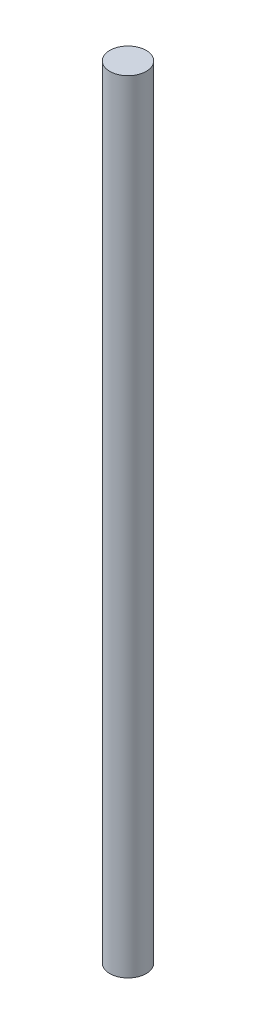
ISO-10303-21;
HEADER;
FILE_DESCRIPTION(('STEP AP214'),'2;1');
FILE_NAME('part.step','',(''),(''),'','','');
FILE_SCHEMA(('AUTOMOTIVE_DESIGN { 1 0 10303 214 1 1 1 1 }'));
ENDSEC;
DATA;
#1=APPLICATION_CONTEXT('core data for automotive mechanical design processes');
#2=APPLICATION_PROTOCOL_DEFINITION('international standard','automotive_design',2000,#1);
#3=PRODUCT_CONTEXT('',#1,'mechanical');
#4=PRODUCT('Part','Part','',(#3));
#5=PRODUCT_RELATED_PRODUCT_CATEGORY('part','',(#4));
#6=PRODUCT_DEFINITION_FORMATION('','',#4);
#7=PRODUCT_DEFINITION_CONTEXT('part definition',#1,'design');
#8=PRODUCT_DEFINITION('design','',#6,#7);
#9=PRODUCT_DEFINITION_SHAPE('','',#8);
#10=(LENGTH_UNIT() NAMED_UNIT(*) SI_UNIT(.MILLI.,.METRE.));
#11=(NAMED_UNIT(*) PLANE_ANGLE_UNIT() SI_UNIT($,.RADIAN.));
#12=(NAMED_UNIT(*) SI_UNIT($,.STERADIAN.) SOLID_ANGLE_UNIT());
#13=UNCERTAINTY_MEASURE_WITH_UNIT(LENGTH_MEASURE(1.E-05),#10,'distance_accuracy_value','');
#14=(GEOMETRIC_REPRESENTATION_CONTEXT(3) GLOBAL_UNCERTAINTY_ASSIGNED_CONTEXT((#13)) GLOBAL_UNIT_ASSIGNED_CONTEXT((#10,
#11,#12)) REPRESENTATION_CONTEXT('',''));
#15=CARTESIAN_POINT('',(0.,0.,0.));
#16=DIRECTION('',(0.,0.,1.));
#17=DIRECTION('',(1.,0.,0.));
#18=AXIS2_PLACEMENT_3D('',#15,#16,#17);
#19=CARTESIAN_POINT('',(2.4,103.,0.));
#20=DIRECTION('',(0.,-1.,0.));
#21=DIRECTION('',(0.,0.,-1.));
#22=AXIS2_PLACEMENT_3D('',#19,#20,#21);
#23=CYLINDRICAL_SURFACE('',#22,2.4);
#24=CARTESIAN_POINT('',(2.4,103.,0.));
#25=DIRECTION('',(0.,1.,0.));
#26=DIRECTION('',(0.,0.,1.));
#27=AXIS2_PLACEMENT_3D('',#24,#25,#26);
#28=CIRCLE('',#27,2.4);
#29=CARTESIAN_POINT('',(2.4,103.,2.4));
#30=VERTEX_POINT('',#29);
#31=EDGE_CURVE('E112',#30,#30,#28,.T.);
#32=ORIENTED_EDGE('',*,*,#31,.F.);
#33=EDGE_LOOP('',(#32));
#34=FACE_BOUND('',#33,.T.);
#35=CARTESIAN_POINT('',(2.4,0.,0.));
#36=DIRECTION('',(0.,1.,0.));
#37=DIRECTION('',(0.,0.,1.));
#38=AXIS2_PLACEMENT_3D('',#35,#36,#37);
#39=CIRCLE('',#38,2.4);
#40=CARTESIAN_POINT('',(2.4,0.,2.4));
#41=VERTEX_POINT('',#40);
#42=EDGE_CURVE('E113',#41,#41,#39,.T.);
#43=ORIENTED_EDGE('',*,*,#42,.T.);
#44=EDGE_LOOP('',(#43));
#45=FACE_BOUND('',#44,.T.);
#46=CARTESIAN_POINT('',(0.526500600480482,100.5,1.5));
#47=CARTESIAN_POINT('',(0.526490399129299,100.574544338164,1.49999354652582));
#48=CARTESIAN_POINT('',(0.521968287493959,100.649205402444,1.49439232619599));
#49=CARTESIAN_POINT('',(0.504675393534264,100.796011584095,1.47238740999521));
#50=CARTESIAN_POINT('',(0.491882202430618,100.868149303638,1.45595436516661));
#51=CARTESIAN_POINT('',(0.4601989760515,101.007338787239,1.41345688694244));
#52=CARTESIAN_POINT('',(0.441361950983593,101.074428730418,1.3874759199934));
#53=CARTESIAN_POINT('',(0.399804591426797,101.203210633966,1.32686334674307));
#54=CARTESIAN_POINT('',(0.377084151015873,101.264902447028,1.29223150447307));
#55=CARTESIAN_POINT('',(0.326644663503442,101.390238185372,1.20988725514034));
#56=CARTESIAN_POINT('',(0.298663941271822,101.453033688999,1.16104331243096));
#57=CARTESIAN_POINT('',(0.242966149741456,101.570259238974,1.05397039739621));
#58=CARTESIAN_POINT('',(0.215249329640026,101.624681996741,0.995733337556844));
#59=CARTESIAN_POINT('',(0.159246553307865,101.730124302178,0.86302399831013));
#60=CARTESIAN_POINT('',(0.131295333102577,101.779941201725,0.787440682692604));
#61=CARTESIAN_POINT('',(0.081801219610297,101.865750245716,0.626884885004711));
#62=CARTESIAN_POINT('',(0.0602519858419225,101.901756078902,0.541921807773821));
#63=CARTESIAN_POINT('',(0.0279619041815897,101.954978772728,0.374132254034361));
#64=CARTESIAN_POINT('',(0.0163449309355592,101.973733699676,0.291966763256634));
#65=CARTESIAN_POINT('',(0.00179346744954645,101.997158483572,0.124926120794642));
#66=CARTESIAN_POINT('',(-0.00115015012398108,102.001843147345,0.0400539126767328));
#67=CARTESIAN_POINT('',(0.00176509070975714,101.997173172867,-0.117678994105642));
#68=CARTESIAN_POINT('',(0.0064956022574745,101.989618348439,-0.1906230279285));
#69=CARTESIAN_POINT('',(0.0222567328650142,101.964159618764,-0.33396797508457));
#70=CARTESIAN_POINT('',(0.0332878280975076,101.946254931315,-0.404368695776821));
#71=CARTESIAN_POINT('',(0.0607423966250082,101.900875469884,-0.541066940492147));
#72=CARTESIAN_POINT('',(0.0771796599171637,101.873376211142,-0.607353450590457));
#73=CARTESIAN_POINT('',(0.11417240532395,101.809837493687,-0.734423064564793));
#74=CARTESIAN_POINT('',(0.13472882549401,101.773796089329,-0.795204910277576));
#75=CARTESIAN_POINT('',(0.181281303007696,101.689166201607,-0.917656218674287));
#76=CARTESIAN_POINT('',(0.207635948382164,101.63957444792,-0.978494813878273));
#77=CARTESIAN_POINT('',(0.2616544469052,101.531841143721,-1.09151831511118));
#78=CARTESIAN_POINT('',(0.289320162355111,101.473687168224,-1.14369040663963));
#79=CARTESIAN_POINT('',(0.347142694942328,101.341553252557,-1.24482535061207));
#80=CARTESIAN_POINT('',(0.377153022743614,101.266498343157,-1.292479385349));
#81=CARTESIAN_POINT('',(0.431830331980405,101.107624656449,-1.37431383803494));
#82=CARTESIAN_POINT('',(0.456507117957947,101.023822387297,-1.40851907514657));
#83=CARTESIAN_POINT('',(0.49089748100341,100.872276716506,-1.45462280230583));
#84=CARTESIAN_POINT('',(0.502839548285552,100.806106844827,-1.47002210067883));
#85=CARTESIAN_POINT('',(0.519850333541949,100.671461773509,-1.49172202243215));
#86=CARTESIAN_POINT('',(0.52492844116458,100.602989854754,-1.49803507623444));
#87=CARTESIAN_POINT('',(0.527446397624287,100.46552558335,-1.50118243145897));
#88=CARTESIAN_POINT('',(0.524868742311096,100.39653239836,-1.49799501092022));
#89=CARTESIAN_POINT('',(0.512447485651224,100.260263302763,-1.48230880267053));
#90=CARTESIAN_POINT('',(0.502597867145096,100.192988862045,-1.46980230384279));
#91=CARTESIAN_POINT('',(0.477239272775543,100.062937939361,-1.43645922869829));
#92=CARTESIAN_POINT('',(0.461826264753677,100.000105592002,-1.41576336752154));
#93=CARTESIAN_POINT('',(0.427013118710151,99.8786551985316,-1.36682942326217));
#94=CARTESIAN_POINT('',(0.407611566121163,99.8200386575706,-1.33858866325701));
#95=CARTESIAN_POINT('',(0.362553552132653,99.6968327529875,-1.26918452126784));
#96=CARTESIAN_POINT('',(0.336409491140486,99.6332309505007,-1.22658448577063));
#97=CARTESIAN_POINT('',(0.283272503991474,99.513377937073,-1.1324283158698));
#98=CARTESIAN_POINT('',(0.256278721159742,99.4571344596264,-1.08086288939589));
#99=CARTESIAN_POINT('',(0.199402031772306,99.3444201045082,-0.960456791398999));
#100=CARTESIAN_POINT('',(0.169749542548816,99.2893577315907,-0.890171939656956));
#101=CARTESIAN_POINT('',(0.115389012419995,99.1919176177489,-0.739559985443443));
#102=CARTESIAN_POINT('',(0.0906786560503944,99.1495339320316,-0.65923761449834));
#103=CARTESIAN_POINT('',(0.0502889285092514,99.0816060105568,-0.495511080763861));
#104=CARTESIAN_POINT('',(0.0341581849298273,99.0552069522351,-0.412577787053365));
#105=CARTESIAN_POINT('',(0.0107158789435176,99.0171279975827,-0.242233198661639));
#106=CARTESIAN_POINT('',(0.00339211280395738,99.0054277322866,-0.154828275885984));
#107=CARTESIAN_POINT('',(-0.00116022898270439,98.9981441759535,0.00791888639622863));
#108=CARTESIAN_POINT('',(0.000280792516601063,99.0004370678556,0.0831375571146215));
#109=CARTESIAN_POINT('',(0.0100711204947391,99.0161540099692,0.23193577331012));
#110=CARTESIAN_POINT('',(0.0184201135017882,99.0295775550909,0.305515393008939));
#111=CARTESIAN_POINT('',(0.0408467437322515,99.0661925698519,0.446451953622679));
#112=CARTESIAN_POINT('',(0.0547155903395981,99.0890290078478,0.51393621681402));
#113=CARTESIAN_POINT('',(0.0870603758728363,99.1434719137969,0.644057242933626));
#114=CARTESIAN_POINT('',(0.105537092023147,99.1750798613707,0.706693185741933));
#115=CARTESIAN_POINT('',(0.147895893122121,99.2497926947895,0.832388084964844));
#116=CARTESIAN_POINT('',(0.172139970396548,99.2937503775828,0.894816152594698));
#117=CARTESIAN_POINT('',(0.222796314525167,99.3900919563993,1.01185993002654));
#118=CARTESIAN_POINT('',(0.249211011232573,99.4424853602952,1.06646669166631));
#119=CARTESIAN_POINT('',(0.305995018805721,99.562939514764,1.174468321561));
#120=CARTESIAN_POINT('',(0.336385542644253,99.6321700142123,1.22655395848582));
#121=CARTESIAN_POINT('',(0.393902142035578,99.7795735992122,1.31852790006896));
#122=CARTESIAN_POINT('',(0.421030017995401,99.8577417058892,1.35842295068522));
#123=CARTESIAN_POINT('',(0.462842687037452,100.003683321516,1.41718933107879));
#124=CARTESIAN_POINT('',(0.478951915804186,100.069962817055,1.43875459531659));
#125=CARTESIAN_POINT('',(0.504730098744737,100.205963133549,1.4725538661649));
#126=CARTESIAN_POINT('',(0.514419427197902,100.275672306029,1.48481741094486));
#127=CARTESIAN_POINT('',(0.522282523327276,100.371636628635,1.49471887419717));
#128=CARTESIAN_POINT('',(0.523859165438082,100.39723697462,1.49669605511497));
#129=CARTESIAN_POINT('',(0.525970095659443,100.448553559826,1.49933789681146));
#130=CARTESIAN_POINT('',(0.526504121640394,100.474269826562,1.50000222752008));
#131=CARTESIAN_POINT('',(0.526500600480482,100.5,1.5));
#132=B_SPLINE_CURVE_WITH_KNOTS('',3,(#46,#47,#48,#49,#50,#51,#52,#53,#54,#55,#56,#57,#58,#59,
#60,#61,#62,#63,#64,#65,#66,#67,#68,#69,#70,#71,#72,#73,#74,#75,#76,#77,#78,#79,#80,#81,#82,#83,
#84,#85,#86,#87,#88,#89,#90,#91,#92,#93,#94,#95,#96,#97,#98,#99,#100,#101,#102,#103,#104,#105,
#106,#107,#108,#109,#110,#111,#112,#113,#114,#115,#116,#117,#118,#119,#120,#121,#122,#123,#124,
#125,#126,#127,#128,#129,#130,#131),.UNSPECIFIED.,.T.,.F.,(4,2,2,2,2,2,2,2,2,2,2,2,2,2,2,2,2,2,
2,2,2,2,2,2,2,2,2,2,2,2,2,2,2,2,2,2,2,2,2,2,2,2,4),(0.,0.22351493281442,0.447637985276548,
0.669846667356522,0.892061411253366,1.14408744892816,1.39633165197502,1.67900683241356,
1.9614011128712,2.21508495378485,2.46850173710872,2.6879078350022,2.90733051691703,
3.12731729791155,3.34735423353813,3.59477405798534,3.8425565281943,4.12269681505455,
4.40231766116644,4.6083933057863,4.81418676011056,5.02045110291196,5.22688630994404,
5.42991854814624,5.63302291786871,5.87479600334462,6.11682118184612,6.39763918395376,
6.6783253087626,6.94224096595768,7.20579049513062,7.43044321832457,7.65508574772607,
7.87193482939617,8.08882051247765,8.32821772932804,8.5678866835295,8.84210180907806,
9.11616491504772,9.32996282726803,9.54307893558371,9.62020930885705,9.6973590713873),.UNSPECIFIED.);
#133=CARTESIAN_POINT('',(0.526500600480482,100.5,1.5));
#134=VERTEX_POINT('',#133);
#135=EDGE_CURVE('E67',#134,#134,#132,.T.);
#136=ORIENTED_EDGE('',*,*,#135,.F.);
#137=EDGE_LOOP('',(#136));
#138=FACE_BOUND('',#137,.T.);
#139=CARTESIAN_POINT('',(0.526500600480482,91.5,1.5));
#140=CARTESIAN_POINT('',(0.5264903991293,91.5745443381635,1.49999354652582));
#141=CARTESIAN_POINT('',(0.521968287493959,91.6492054024443,1.49439232619599));
#142=CARTESIAN_POINT('',(0.504675393534262,91.7960115840953,1.47238740999521));
#143=CARTESIAN_POINT('',(0.491882202430617,91.8681493036383,1.45595436516661));
#144=CARTESIAN_POINT('',(0.4601989760515,92.0073387872386,1.41345688694244));
#145=CARTESIAN_POINT('',(0.441361950983593,92.0744287304182,1.3874759199934));
#146=CARTESIAN_POINT('',(0.399804591426797,92.2032106339658,1.32686334674307));
#147=CARTESIAN_POINT('',(0.377084151015873,92.2649024470279,1.29223150447307));
#148=CARTESIAN_POINT('',(0.326644663503441,92.3902381853724,1.20988725514034));
#149=CARTESIAN_POINT('',(0.29866394127182,92.4530336889992,1.16104331243096));
#150=CARTESIAN_POINT('',(0.242966149741454,92.570259238974,1.0539703973962));
#151=CARTESIAN_POINT('',(0.215249329640024,92.6246819967408,0.995733337556841));
#152=CARTESIAN_POINT('',(0.159246553307864,92.7301243021778,0.863023998310127));
#153=CARTESIAN_POINT('',(0.131295333102576,92.7799412017252,0.787440682692601));
#154=CARTESIAN_POINT('',(0.0818012196102967,92.8657502457158,0.626884885004708));
#155=CARTESIAN_POINT('',(0.0602519858419223,92.9017560789015,0.541921807773819));
#156=CARTESIAN_POINT('',(0.0279619041815893,92.9549787727285,0.374132254034359));
#157=CARTESIAN_POINT('',(0.0163449309355589,92.9737336996763,0.291966763256632));
#158=CARTESIAN_POINT('',(0.00179346744954667,92.9971584835721,0.12492612079464));
#159=CARTESIAN_POINT('',(-0.00115015012398062,93.0018431473446,0.0400539126767319));
#160=CARTESIAN_POINT('',(0.00176509070975712,92.9971731728669,-0.117678994105643));
#161=CARTESIAN_POINT('',(0.00649560225747401,92.989618348439,-0.190623027928502));
#162=CARTESIAN_POINT('',(0.0222567328650139,92.9641596187639,-0.333967975084571));
#163=CARTESIAN_POINT('',(0.0332878280975077,92.9462549313148,-0.404368695776822));
#164=CARTESIAN_POINT('',(0.060742396625009,92.9008754698836,-0.541066940492149));
#165=CARTESIAN_POINT('',(0.0771796599171649,92.8733762111423,-0.607353450590461));
#166=CARTESIAN_POINT('',(0.114172405323951,92.8098374936873,-0.734423064564796));
#167=CARTESIAN_POINT('',(0.134728825494011,92.7737960893288,-0.795204910277577));
#168=CARTESIAN_POINT('',(0.181281303007698,92.6891662016074,-0.917656218674292));
#169=CARTESIAN_POINT('',(0.207635948382168,92.6395744479199,-0.978494813878281));
#170=CARTESIAN_POINT('',(0.261654446905204,92.5318411437212,-1.09151831511119));
#171=CARTESIAN_POINT('',(0.289320162355112,92.4736871682239,-1.14369040663963));
#172=CARTESIAN_POINT('',(0.347142694942327,92.3415532525569,-1.24482535061206));
#173=CARTESIAN_POINT('',(0.377153022743614,92.2664983431572,-1.292479385349));
#174=CARTESIAN_POINT('',(0.431830331980405,92.1076246564493,-1.37431383803494));
#175=CARTESIAN_POINT('',(0.456507117957947,92.0238223872974,-1.40851907514657));
#176=CARTESIAN_POINT('',(0.490897481003409,91.8722767165063,-1.45462280230583));
#177=CARTESIAN_POINT('',(0.502839548285551,91.8061068448272,-1.47002210067882));
#178=CARTESIAN_POINT('',(0.519850333541949,91.6714617735088,-1.49172202243215));
#179=CARTESIAN_POINT('',(0.52492844116458,91.6029898547541,-1.49803507623444));
#180=CARTESIAN_POINT('',(0.527446397624286,91.4655255833496,-1.50118243145897));
#181=CARTESIAN_POINT('',(0.524868742311096,91.3965323983604,-1.49799501092022));
#182=CARTESIAN_POINT('',(0.512447485651224,91.2602633027626,-1.48230880267053));
#183=CARTESIAN_POINT('',(0.502597867145096,91.1929888620446,-1.46980230384279));
#184=CARTESIAN_POINT('',(0.477239272775542,91.0629379393609,-1.43645922869829));
#185=CARTESIAN_POINT('',(0.461826264753676,91.0001055920021,-1.41576336752154));
#186=CARTESIAN_POINT('',(0.42701311871015,90.8786551985316,-1.36682942326216));
#187=CARTESIAN_POINT('',(0.407611566121162,90.8200386575706,-1.33858866325701));
#188=CARTESIAN_POINT('',(0.362553552132652,90.6968327529875,-1.26918452126784));
#189=CARTESIAN_POINT('',(0.336409491140483,90.6332309505008,-1.22658448577063));
#190=CARTESIAN_POINT('',(0.283272503991471,90.513377937073,-1.13242831586979));
#191=CARTESIAN_POINT('',(0.256278721159741,90.4571344596264,-1.08086288939588));
#192=CARTESIAN_POINT('',(0.199402031772307,90.3444201045082,-0.960456791398999));
#193=CARTESIAN_POINT('',(0.169749542548817,90.2893577315907,-0.890171939656956));
#194=CARTESIAN_POINT('',(0.115389012419995,90.1919176177489,-0.739559985443442));
#195=CARTESIAN_POINT('',(0.090678656050394,90.1495339320316,-0.659237614498339));
#196=CARTESIAN_POINT('',(0.0502889285092514,90.0816060105568,-0.49551108076386));
#197=CARTESIAN_POINT('',(0.0341581849298275,90.0552069522351,-0.412577787053365));
#198=CARTESIAN_POINT('',(0.0107158789435178,90.0171279975827,-0.242233198661639));
#199=CARTESIAN_POINT('',(0.00339211280395737,90.0054277322867,-0.154828275885983));
#200=CARTESIAN_POINT('',(-0.00116022898270452,89.9981441759535,0.00791888639622893));
#201=CARTESIAN_POINT('',(0.000280792516601001,90.0004370678556,0.0831375571146214));
#202=CARTESIAN_POINT('',(0.010071120494739,90.0161540099692,0.23193577331012));
#203=CARTESIAN_POINT('',(0.0184201135017882,90.0295775550909,0.30551539300894));
#204=CARTESIAN_POINT('',(0.0408467437322513,90.0661925698519,0.446451953622678));
#205=CARTESIAN_POINT('',(0.0547155903395976,90.0890290078478,0.513936216814017));
#206=CARTESIAN_POINT('',(0.0870603758728353,90.1434719137969,0.644057242933623));
#207=CARTESIAN_POINT('',(0.105537092023146,90.1750798613707,0.706693185741932));
#208=CARTESIAN_POINT('',(0.14789589312212,90.2497926947895,0.832388084964842));
#209=CARTESIAN_POINT('',(0.172139970396547,90.2937503775828,0.894816152594695));
#210=CARTESIAN_POINT('',(0.222796314525166,90.3900919563993,1.01185993002654));
#211=CARTESIAN_POINT('',(0.249211011232572,90.4424853602952,1.06646669166631));
#212=CARTESIAN_POINT('',(0.30599501880572,90.562939514764,1.174468321561));
#213=CARTESIAN_POINT('',(0.336385542644253,90.6321700142123,1.22655395848582));
#214=CARTESIAN_POINT('',(0.393902142035578,90.7795735992122,1.31852790006896));
#215=CARTESIAN_POINT('',(0.421030017995401,90.8577417058892,1.35842295068522));
#216=CARTESIAN_POINT('',(0.462842687037453,91.0036833215157,1.41718933107879));
#217=CARTESIAN_POINT('',(0.478951915804187,91.0699628170553,1.43875459531659));
#218=CARTESIAN_POINT('',(0.504730098744738,91.2059631335487,1.47255386616491));
#219=CARTESIAN_POINT('',(0.514419427197902,91.275672306029,1.48481741094487));
#220=CARTESIAN_POINT('',(0.522282523327275,91.3716366286355,1.49471887419717));
#221=CARTESIAN_POINT('',(0.523859165438081,91.3972369746204,1.49669605511497));
#222=CARTESIAN_POINT('',(0.525970095659443,91.4485535598258,1.49933789681146));
#223=CARTESIAN_POINT('',(0.526504121640394,91.474269826562,1.50000222752008));
#224=CARTESIAN_POINT('',(0.526500600480482,91.5,1.5));
#225=B_SPLINE_CURVE_WITH_KNOTS('',3,(#139,#140,#141,#142,#143,#144,#145,#146,#147,#148,#149,
#150,#151,#152,#153,#154,#155,#156,#157,#158,#159,#160,#161,#162,#163,#164,#165,#166,#167,#168,
#169,#170,#171,#172,#173,#174,#175,#176,#177,#178,#179,#180,#181,#182,#183,#184,#185,#186,#187,
#188,#189,#190,#191,#192,#193,#194,#195,#196,#197,#198,#199,#200,#201,#202,#203,#204,#205,#206,
#207,#208,#209,#210,#211,#212,#213,#214,#215,#216,#217,#218,#219,#220,#221,#222,#223,#224),
.UNSPECIFIED.,.T.,.F.,(4,2,2,2,2,2,2,2,2,2,2,2,2,2,2,2,2,2,2,2,2,2,2,2,2,2,2,2,2,2,2,2,2,2,2,2,
2,2,2,2,2,2,4),(0.,0.223514932814434,0.447637985276548,0.669846667356522,0.892061411253366,
1.14408744892817,1.39633165197502,1.67900683241357,1.9614011128712,2.21508495378485,
2.46850173710872,2.6879078350022,2.90733051691703,3.12731729791155,3.34735423353813,
3.59477405798536,3.84255652819431,4.12269681505454,4.40231766116644,4.60839330578629,
4.81418676011056,5.02045110291196,5.22688630994404,5.42991854814626,5.63302291786871,
5.87479600334463,6.11682118184613,6.39763918395376,6.6783253087626,6.94224096595768,
7.20579049513062,7.43044321832457,7.65508574772607,7.87193482939616,8.08882051247765,
8.32821772932803,8.5678866835295,8.84210180907806,9.11616491504773,9.32996282726805,
9.54307893558372,9.62020930885704,9.6973590713873),.UNSPECIFIED.);
#226=CARTESIAN_POINT('',(0.526500600480482,91.5,1.5));
#227=VERTEX_POINT('',#226);
#228=EDGE_CURVE('E62',#227,#227,#225,.T.);
#229=ORIENTED_EDGE('',*,*,#228,.F.);
#230=EDGE_LOOP('',(#229));
#231=FACE_BOUND('',#230,.T.);
#232=CARTESIAN_POINT('',(0.52650060048048,11.5,1.5));
#233=CARTESIAN_POINT('',(0.526490399129298,11.5745443381635,1.49999354652582));
#234=CARTESIAN_POINT('',(0.521968287493958,11.6492054024443,1.49439232619599));
#235=CARTESIAN_POINT('',(0.504675393534261,11.7960115840953,1.47238740999521));
#236=CARTESIAN_POINT('',(0.491882202430615,11.8681493036383,1.4559543651666));
#237=CARTESIAN_POINT('',(0.460198976051497,12.0073387872386,1.41345688694244));
#238=CARTESIAN_POINT('',(0.441361950983591,12.0744287304182,1.3874759199934));
#239=CARTESIAN_POINT('',(0.399804591426795,12.2032106339658,1.32686334674306));
#240=CARTESIAN_POINT('',(0.377084151015871,12.2649024470279,1.29223150447307));
#241=CARTESIAN_POINT('',(0.32664466350344,12.3902381853724,1.20988725514033));
#242=CARTESIAN_POINT('',(0.298663941271821,12.4530336889992,1.16104331243096));
#243=CARTESIAN_POINT('',(0.242966149741455,12.570259238974,1.05397039739621));
#244=CARTESIAN_POINT('',(0.215249329640024,12.6246819967408,0.995733337556841));
#245=CARTESIAN_POINT('',(0.159246553307865,12.7301243021778,0.863023998310128));
#246=CARTESIAN_POINT('',(0.131295333102577,12.7799412017252,0.787440682692604));
#247=CARTESIAN_POINT('',(0.0818012196102973,12.8657502457158,0.62688488500471));
#248=CARTESIAN_POINT('',(0.0602519858419216,12.9017560789015,0.541921807773817));
#249=CARTESIAN_POINT('',(0.0279619041815886,12.9549787727285,0.374132254034354));
#250=CARTESIAN_POINT('',(0.0163449309355588,12.9737336996763,0.291966763256628));
#251=CARTESIAN_POINT('',(0.00179346744954703,12.9971584835721,0.124926120794638));
#252=CARTESIAN_POINT('',(-0.00115015012398048,13.0018431473446,0.0400539126767306));
#253=CARTESIAN_POINT('',(0.00176509070975696,12.9971731728669,-0.117678994105641));
#254=CARTESIAN_POINT('',(0.00649560225747365,12.989618348439,-0.190623027928499));
#255=CARTESIAN_POINT('',(0.0222567328650134,12.964159618764,-0.333967975084569));
#256=CARTESIAN_POINT('',(0.0332878280975076,12.9462549313148,-0.404368695776821));
#257=CARTESIAN_POINT('',(0.0607423966250084,12.9008754698836,-0.541066940492147));
#258=CARTESIAN_POINT('',(0.077179659917163,12.8733762111423,-0.607353450590455));
#259=CARTESIAN_POINT('',(0.114172405323949,12.8098374936873,-0.734423064564791));
#260=CARTESIAN_POINT('',(0.13472882549401,12.7737960893288,-0.795204910277574));
#261=CARTESIAN_POINT('',(0.181281303007698,12.6891662016074,-0.917656218674291));
#262=CARTESIAN_POINT('',(0.207635948382167,12.6395744479199,-0.978494813878279));
#263=CARTESIAN_POINT('',(0.261654446905202,12.5318411437212,-1.09151831511119));
#264=CARTESIAN_POINT('',(0.28932016235511,12.4736871682239,-1.14369040663963));
#265=CARTESIAN_POINT('',(0.347142694942325,12.3415532525569,-1.24482535061206));
#266=CARTESIAN_POINT('',(0.377153022743613,12.2664983431572,-1.292479385349));
#267=CARTESIAN_POINT('',(0.431830331980403,12.1076246564493,-1.37431383803494));
#268=CARTESIAN_POINT('',(0.456507117957945,12.0238223872974,-1.40851907514656));
#269=CARTESIAN_POINT('',(0.490897481003408,11.8722767165063,-1.45462280230583));
#270=CARTESIAN_POINT('',(0.502839548285551,11.8061068448272,-1.47002210067883));
#271=CARTESIAN_POINT('',(0.519850333541949,11.6714617735088,-1.49172202243215));
#272=CARTESIAN_POINT('',(0.524928441164579,11.6029898547541,-1.49803507623444));
#273=CARTESIAN_POINT('',(0.527446397624284,11.4655255833496,-1.50118243145897));
#274=CARTESIAN_POINT('',(0.524868742311093,11.3965323983604,-1.49799501092022));
#275=CARTESIAN_POINT('',(0.512447485651221,11.2602633027626,-1.48230880267053));
#276=CARTESIAN_POINT('',(0.502597867145092,11.1929888620446,-1.46980230384278));
#277=CARTESIAN_POINT('',(0.477239272775538,11.0629379393608,-1.43645922869829));
#278=CARTESIAN_POINT('',(0.461826264753672,11.0001055920021,-1.41576336752153));
#279=CARTESIAN_POINT('',(0.427013118710145,10.8786551985316,-1.36682942326216));
#280=CARTESIAN_POINT('',(0.407611566121157,10.8200386575706,-1.338588663257));
#281=CARTESIAN_POINT('',(0.362553552132647,10.6968327529875,-1.26918452126783));
#282=CARTESIAN_POINT('',(0.336409491140479,10.6332309505008,-1.22658448577062));
#283=CARTESIAN_POINT('',(0.283272503991466,10.513377937073,-1.13242831586978));
#284=CARTESIAN_POINT('',(0.256278721159734,10.4571344596264,-1.08086288939587));
#285=CARTESIAN_POINT('',(0.199402031772298,10.3444201045082,-0.960456791398979));
#286=CARTESIAN_POINT('',(0.169749542548809,10.2893577315907,-0.890171939656937));
#287=CARTESIAN_POINT('',(0.115389012419989,10.1919176177489,-0.739559985443425));
#288=CARTESIAN_POINT('',(0.0906786560503896,10.1495339320316,-0.659237614498325));
#289=CARTESIAN_POINT('',(0.0502889285092484,10.0816060105568,-0.495511080763847));
#290=CARTESIAN_POINT('',(0.034158184929825,10.0552069522351,-0.41257778705335));
#291=CARTESIAN_POINT('',(0.0107158789435163,10.0171279975827,-0.242233198661623));
#292=CARTESIAN_POINT('',(0.00339211280395648,10.0054277322867,-0.154828275885969));
#293=CARTESIAN_POINT('',(-0.00116022898270444,9.99814417595346,0.00791888639624346));
#294=CARTESIAN_POINT('',(0.000280792516601422,10.0004370678556,0.0831375571146362));
#295=CARTESIAN_POINT('',(0.0100711204947402,10.0161540099692,0.231935773310135));
#296=CARTESIAN_POINT('',(0.0184201135017897,10.0295775550909,0.305515393008953));
#297=CARTESIAN_POINT('',(0.0408467437322535,10.0661925698519,0.44645195362269));
#298=CARTESIAN_POINT('',(0.0547155903395999,10.0890290078479,0.513936216814029));
#299=CARTESIAN_POINT('',(0.0870603758728384,10.1434719137969,0.644057242933634));
#300=CARTESIAN_POINT('',(0.105537092023149,10.1750798613707,0.706693185741943));
#301=CARTESIAN_POINT('',(0.147895893122124,10.2497926947895,0.832388084964852));
#302=CARTESIAN_POINT('',(0.172139970396551,10.2937503775828,0.894816152594705));
#303=CARTESIAN_POINT('',(0.22279631452517,10.3900919563993,1.01185993002655));
#304=CARTESIAN_POINT('',(0.249211011232577,10.4424853602952,1.06646669166632));
#305=CARTESIAN_POINT('',(0.305995018805728,10.562939514764,1.17446832156101));
#306=CARTESIAN_POINT('',(0.336385542644261,10.6321700142124,1.22655395848583));
#307=CARTESIAN_POINT('',(0.393902142035585,10.7795735992122,1.31852790006896));
#308=CARTESIAN_POINT('',(0.421030017995406,10.8577417058892,1.35842295068523));
#309=CARTESIAN_POINT('',(0.462842687037455,11.0036833215157,1.41718933107879));
#310=CARTESIAN_POINT('',(0.478951915804188,11.0699628170553,1.43875459531659));
#311=CARTESIAN_POINT('',(0.504730098744738,11.2059631335487,1.47255386616491));
#312=CARTESIAN_POINT('',(0.514419427197902,11.275672306029,1.48481741094487));
#313=CARTESIAN_POINT('',(0.522282523327275,11.3716366286355,1.49471887419717));
#314=CARTESIAN_POINT('',(0.52385916543808,11.3972369746204,1.49669605511497));
#315=CARTESIAN_POINT('',(0.525970095659441,11.4485535598258,1.49933789681146));
#316=CARTESIAN_POINT('',(0.526504121640392,11.474269826562,1.50000222752008));
#317=CARTESIAN_POINT('',(0.52650060048048,11.5,1.5));
#318=B_SPLINE_CURVE_WITH_KNOTS('',3,(#232,#233,#234,#235,#236,#237,#238,#239,#240,#241,#242,
#243,#244,#245,#246,#247,#248,#249,#250,#251,#252,#253,#254,#255,#256,#257,#258,#259,#260,#261,
#262,#263,#264,#265,#266,#267,#268,#269,#270,#271,#272,#273,#274,#275,#276,#277,#278,#279,#280,
#281,#282,#283,#284,#285,#286,#287,#288,#289,#290,#291,#292,#293,#294,#295,#296,#297,#298,#299,
#300,#301,#302,#303,#304,#305,#306,#307,#308,#309,#310,#311,#312,#313,#314,#315,#316,#317),
.UNSPECIFIED.,.T.,.F.,(4,2,2,2,2,2,2,2,2,2,2,2,2,2,2,2,2,2,2,2,2,2,2,2,2,2,2,2,2,2,2,2,2,2,2,2,
2,2,2,2,2,2,4),(0.,0.223514932814434,0.447637985276548,0.669846667356531,0.892061411253366,
1.14408744892816,1.39633165197501,1.67900683241356,1.9614011128712,2.21508495378485,
2.46850173710871,2.68790783500219,2.90733051691703,3.12731729791154,3.34735423353812,
3.59477405798535,3.8425565281943,4.12269681505454,4.40231766116643,4.6083933057863,
4.81418676011056,5.02045110291195,5.22688630994405,5.42991854814626,5.63302291786871,
5.87479600334463,6.11682118184614,6.39763918395377,6.67832530876261,6.94224096595768,
7.20579049513062,7.43044321832457,7.65508574772607,7.87193482939617,8.08882051247765,
8.32821772932803,8.56788668352951,8.84210180907808,9.11616491504773,9.32996282726805,
9.54307893558371,9.62020930885703,9.69735907138729),.UNSPECIFIED.);
#319=CARTESIAN_POINT('',(0.52650060048048,11.5,1.5));
#320=VERTEX_POINT('',#319);
#321=EDGE_CURVE('E57',#320,#320,#318,.T.);
#322=ORIENTED_EDGE('',*,*,#321,.F.);
#323=EDGE_LOOP('',(#322));
#324=FACE_BOUND('',#323,.T.);
#325=CARTESIAN_POINT('',(0.52650060048048,2.5,1.5));
#326=CARTESIAN_POINT('',(0.526490399129298,2.57454433816352,1.49999354652582));
#327=CARTESIAN_POINT('',(0.521968287493957,2.64920540244432,1.49439232619599));
#328=CARTESIAN_POINT('',(0.504675393534261,2.79601158409528,1.47238740999521));
#329=CARTESIAN_POINT('',(0.491882202430615,2.86814930363831,1.4559543651666));
#330=CARTESIAN_POINT('',(0.460198976051497,3.00733878723865,1.41345688694244));
#331=CARTESIAN_POINT('',(0.441361950983591,3.07442873041822,1.3874759199934));
#332=CARTESIAN_POINT('',(0.399804591426794,3.20321063396583,1.32686334674306));
#333=CARTESIAN_POINT('',(0.377084151015871,3.26490244702786,1.29223150447307));
#334=CARTESIAN_POINT('',(0.32664466350344,3.39023818537243,1.20988725514033));
#335=CARTESIAN_POINT('',(0.298663941271821,3.45303368899916,1.16104331243096));
#336=CARTESIAN_POINT('',(0.242966149741455,3.57025923897401,1.0539703973962));
#337=CARTESIAN_POINT('',(0.215249329640024,3.62468199674075,0.995733337556841));
#338=CARTESIAN_POINT('',(0.159246553307864,3.73012430217779,0.863023998310128));
#339=CARTESIAN_POINT('',(0.131295333102577,3.77994120172521,0.787440682692604));
#340=CARTESIAN_POINT('',(0.0818012196102967,3.86575024571582,0.626884885004709));
#341=CARTESIAN_POINT('',(0.0602519858419213,3.90175607890153,0.541921807773815));
#342=CARTESIAN_POINT('',(0.0279619041815883,3.95497877272849,0.374132254034352));
#343=CARTESIAN_POINT('',(0.0163449309355582,3.97373369967634,0.291966763256626));
#344=CARTESIAN_POINT('',(0.00179346744954632,3.99715848357208,0.124926120794637));
#345=CARTESIAN_POINT('',(-0.00115015012398094,4.00184314734465,0.040053912676729));
#346=CARTESIAN_POINT('',(0.00176509070975713,3.99717317286687,-0.117678994105643));
#347=CARTESIAN_POINT('',(0.00649560225747423,3.98961834843895,-0.190623027928501));
#348=CARTESIAN_POINT('',(0.0222567328650142,3.96415961876396,-0.33396797508457));
#349=CARTESIAN_POINT('',(0.0332878280975083,3.94625493131479,-0.404368695776822));
#350=CARTESIAN_POINT('',(0.0607423966250088,3.90087546988361,-0.541066940492148));
#351=CARTESIAN_POINT('',(0.0771796599171636,3.87337621114231,-0.607353450590456));
#352=CARTESIAN_POINT('',(0.114172405323949,3.80983749368734,-0.734423064564792));
#353=CARTESIAN_POINT('',(0.13472882549401,3.77379608932883,-0.795204910277575));
#354=CARTESIAN_POINT('',(0.181281303007698,3.68916620160743,-0.917656218674292));
#355=CARTESIAN_POINT('',(0.207635948382167,3.63957444791987,-0.978494813878281));
#356=CARTESIAN_POINT('',(0.261654446905203,3.53184114372117,-1.09151831511119));
#357=CARTESIAN_POINT('',(0.289320162355111,3.47368716822386,-1.14369040663963));
#358=CARTESIAN_POINT('',(0.347142694942326,3.34155325255695,-1.24482535061206));
#359=CARTESIAN_POINT('',(0.377153022743613,3.26649834315721,-1.292479385349));
#360=CARTESIAN_POINT('',(0.431830331980404,3.10762465644927,-1.37431383803494));
#361=CARTESIAN_POINT('',(0.456507117957945,3.02382238729743,-1.40851907514656));
#362=CARTESIAN_POINT('',(0.490897481003409,2.87227671650628,-1.45462280230583));
#363=CARTESIAN_POINT('',(0.502839548285552,2.80610684482717,-1.47002210067883));
#364=CARTESIAN_POINT('',(0.519850333541949,2.67146177350875,-1.49172202243215));
#365=CARTESIAN_POINT('',(0.524928441164579,2.60298985475407,-1.49803507623444));
#366=CARTESIAN_POINT('',(0.527446397624285,2.46552558334958,-1.50118243145897));
#367=CARTESIAN_POINT('',(0.524868742311093,2.3965323983604,-1.49799501092022));
#368=CARTESIAN_POINT('',(0.51244748565122,2.26026330276256,-1.48230880267053));
#369=CARTESIAN_POINT('',(0.502597867145091,2.19298886204457,-1.46980230384278));
#370=CARTESIAN_POINT('',(0.477239272775536,2.06293793936083,-1.43645922869828));
#371=CARTESIAN_POINT('',(0.46182626475367,2.00010559200209,-1.41576336752153));
#372=CARTESIAN_POINT('',(0.427013118710143,1.8786551985316,-1.36682942326215));
#373=CARTESIAN_POINT('',(0.407611566121154,1.82003865757056,-1.33858866325699));
#374=CARTESIAN_POINT('',(0.362553552132644,1.69683275298749,-1.26918452126783));
#375=CARTESIAN_POINT('',(0.336409491140476,1.63323095050075,-1.22658448577062));
#376=CARTESIAN_POINT('',(0.283272503991463,1.51337793707297,-1.13242831586978));
#377=CARTESIAN_POINT('',(0.256278721159731,1.45713445962639,-1.08086288939586));
#378=CARTESIAN_POINT('',(0.199402031772295,1.34442010450816,-0.960456791398972));
#379=CARTESIAN_POINT('',(0.169749542548806,1.28935773159074,-0.89017193965693));
#380=CARTESIAN_POINT('',(0.115389012419987,1.19191761774893,-0.739559985443417));
#381=CARTESIAN_POINT('',(0.0906786560503873,1.14953393203159,-0.659237614498316));
#382=CARTESIAN_POINT('',(0.0502889285092465,1.0816060105568,-0.495511080763837));
#383=CARTESIAN_POINT('',(0.0341581849298234,1.05520695223506,-0.41257778705334));
#384=CARTESIAN_POINT('',(0.0107158789435157,1.01712799758268,-0.242233198661614));
#385=CARTESIAN_POINT('',(0.00339211280395638,1.00542773228666,-0.15482827588596));
#386=CARTESIAN_POINT('',(-0.00116022898270415,0.99814417595346,0.00791888639625114));
#387=CARTESIAN_POINT('',(0.000280792516601666,1.00043706785562,0.0831375571146436));
#388=CARTESIAN_POINT('',(0.010071120494741,1.01615400996921,0.231935773310141));
#389=CARTESIAN_POINT('',(0.0184201135017911,1.02957755509094,0.30551539300896));
#390=CARTESIAN_POINT('',(0.0408467437322551,1.06619256985193,0.446451953622697));
#391=CARTESIAN_POINT('',(0.0547155903396012,1.08902900784787,0.513936216814035));
#392=CARTESIAN_POINT('',(0.0870603758728397,1.14347191379691,0.64405724293364));
#393=CARTESIAN_POINT('',(0.105537092023151,1.17507986137074,0.706693185741949));
#394=CARTESIAN_POINT('',(0.147895893122126,1.24979269478948,0.832388084964859));
#395=CARTESIAN_POINT('',(0.172139970396554,1.29375037758282,0.894816152594712));
#396=CARTESIAN_POINT('',(0.222796314525174,1.39009195639929,1.01185993002655));
#397=CARTESIAN_POINT('',(0.24921101123258,1.44248536029519,1.06646669166633));
#398=CARTESIAN_POINT('',(0.305995018805731,1.56293951476399,1.17446832156102));
#399=CARTESIAN_POINT('',(0.336385542644265,1.63217001421237,1.22655395848584));
#400=CARTESIAN_POINT('',(0.393902142035588,1.77957359921222,1.31852790006897));
#401=CARTESIAN_POINT('',(0.421030017995409,1.85774170588919,1.35842295068523));
#402=CARTESIAN_POINT('',(0.462842687037456,2.00368332151569,1.4171893310788));
#403=CARTESIAN_POINT('',(0.47895191580419,2.06996281705532,1.4387545953166));
#404=CARTESIAN_POINT('',(0.504730098744739,2.20596313354871,1.47255386616491));
#405=CARTESIAN_POINT('',(0.514419427197903,2.27567230602905,1.48481741094487));
#406=CARTESIAN_POINT('',(0.522282523327275,2.37163662863549,1.49471887419717));
#407=CARTESIAN_POINT('',(0.52385916543808,2.39723697462044,1.49669605511497));
#408=CARTESIAN_POINT('',(0.525970095659441,2.44855355982581,1.49933789681146));
#409=CARTESIAN_POINT('',(0.526504121640392,2.47426982656204,1.50000222752008));
#410=CARTESIAN_POINT('',(0.52650060048048,2.5,1.5));
#411=B_SPLINE_CURVE_WITH_KNOTS('',3,(#325,#326,#327,#328,#329,#330,#331,#332,#333,#334,#335,
#336,#337,#338,#339,#340,#341,#342,#343,#344,#345,#346,#347,#348,#349,#350,#351,#352,#353,#354,
#355,#356,#357,#358,#359,#360,#361,#362,#363,#364,#365,#366,#367,#368,#369,#370,#371,#372,#373,
#374,#375,#376,#377,#378,#379,#380,#381,#382,#383,#384,#385,#386,#387,#388,#389,#390,#391,#392,
#393,#394,#395,#396,#397,#398,#399,#400,#401,#402,#403,#404,#405,#406,#407,#408,#409,#410),
.UNSPECIFIED.,.T.,.F.,(4,2,2,2,2,2,2,2,2,2,2,2,2,2,2,2,2,2,2,2,2,2,2,2,2,2,2,2,2,2,2,2,2,2,2,2,
2,2,2,2,2,2,4),(0.,0.223514932814434,0.447637985276549,0.669846667356532,0.892061411253367,
1.14408744892816,1.39633165197501,1.67900683241356,1.9614011128712,2.21508495378485,
2.46850173710871,2.6879078350022,2.90733051691703,3.12731729791154,3.34735423353812,
3.59477405798536,3.8425565281943,4.12269681505454,4.40231766116643,4.60839330578631,
4.81418676011057,5.02045110291196,5.22688630994405,5.42991854814627,5.63302291786871,
5.87479600334464,6.11682118184615,6.39763918395378,6.67832530876262,6.94224096595769,
7.20579049513063,7.43044321832458,7.65508574772608,7.87193482939617,8.08882051247766,
8.32821772932805,8.56788668352952,8.84210180907809,9.11616491504775,9.32996282726806,
9.54307893558373,9.62020930885704,9.69735907138729),.UNSPECIFIED.);
#412=CARTESIAN_POINT('',(0.52650060048048,2.5,1.5));
#413=VERTEX_POINT('',#412);
#414=EDGE_CURVE('E10',#413,#413,#411,.T.);
#415=ORIENTED_EDGE('',*,*,#414,.F.);
#416=EDGE_LOOP('',(#415));
#417=FACE_BOUND('',#416,.T.);
#418=ADVANCED_FACE('F45',(#34,#45,#138,#231,#324,#417),#23,.T.);
#419=CARTESIAN_POINT('',(2.4,103.,0.));
#420=DIRECTION('',(0.,1.,0.));
#421=DIRECTION('',(0.,0.,1.));
#422=AXIS2_PLACEMENT_3D('',#419,#420,#421);
#423=PLANE('',#422);
#424=ORIENTED_EDGE('',*,*,#31,.T.);
#425=EDGE_LOOP('',(#424));
#426=FACE_BOUND('',#425,.T.);
#427=ADVANCED_FACE('F144',(#426),#423,.T.);
#428=CARTESIAN_POINT('',(2.4,0.,0.));
#429=DIRECTION('',(0.,1.,0.));
#430=DIRECTION('',(0.,0.,1.));
#431=AXIS2_PLACEMENT_3D('',#428,#429,#430);
#432=PLANE('',#431);
#433=ORIENTED_EDGE('',*,*,#42,.F.);
#434=EDGE_LOOP('',(#433));
#435=FACE_BOUND('',#434,.T.);
#436=ADVANCED_FACE('F103',(#435),#432,.F.);
#437=CARTESIAN_POINT('',(3.,100.5,0.));
#438=DIRECTION('',(-1.,0.,0.));
#439=DIRECTION('',(0.,0.,1.));
#440=AXIS2_PLACEMENT_3D('',#437,#438,#439);
#441=CYLINDRICAL_SURFACE('',#440,1.5);
#442=CARTESIAN_POINT('',(3.,100.5,0.));
#443=DIRECTION('',(1.,0.,0.));
#444=DIRECTION('',(0.,0.,-1.));
#445=AXIS2_PLACEMENT_3D('',#442,#443,#444);
#446=CIRCLE('',#445,1.5);
#447=CARTESIAN_POINT('',(3.,100.5,-1.5));
#448=VERTEX_POINT('',#447);
#449=EDGE_CURVE('E121',#448,#448,#446,.T.);
#450=ORIENTED_EDGE('',*,*,#449,.T.);
#451=EDGE_LOOP('',(#450));
#452=FACE_BOUND('',#451,.T.);
#453=ORIENTED_EDGE('',*,*,#135,.T.);
#454=EDGE_LOOP('',(#453));
#455=FACE_BOUND('',#454,.T.);
#456=ADVANCED_FACE('F99',(#452,#455),#441,.F.);
#457=CARTESIAN_POINT('',(3.,100.5,0.));
#458=DIRECTION('',(1.,0.,0.));
#459=DIRECTION('',(0.,0.,-1.));
#460=AXIS2_PLACEMENT_3D('',#457,#458,#459);
#461=PLANE('',#460);
#462=ORIENTED_EDGE('',*,*,#449,.F.);
#463=EDGE_LOOP('',(#462));
#464=FACE_BOUND('',#463,.T.);
#465=ADVANCED_FACE('F94',(#464),#461,.F.);
#466=CARTESIAN_POINT('',(3.,91.5,0.));
#467=DIRECTION('',(-1.,0.,0.));
#468=DIRECTION('',(0.,0.,1.));
#469=AXIS2_PLACEMENT_3D('',#466,#467,#468);
#470=CYLINDRICAL_SURFACE('',#469,1.5);
#471=CARTESIAN_POINT('',(3.,91.5,0.));
#472=DIRECTION('',(1.,0.,0.));
#473=DIRECTION('',(0.,0.,-1.));
#474=AXIS2_PLACEMENT_3D('',#471,#472,#473);
#475=CIRCLE('',#474,1.5);
#476=CARTESIAN_POINT('',(3.,91.5,-1.5));
#477=VERTEX_POINT('',#476);
#478=EDGE_CURVE('E125',#477,#477,#475,.T.);
#479=ORIENTED_EDGE('',*,*,#478,.T.);
#480=EDGE_LOOP('',(#479));
#481=FACE_BOUND('',#480,.T.);
#482=ORIENTED_EDGE('',*,*,#228,.T.);
#483=EDGE_LOOP('',(#482));
#484=FACE_BOUND('',#483,.T.);
#485=ADVANCED_FACE('F90',(#481,#484),#470,.F.);
#486=CARTESIAN_POINT('',(3.,91.5,0.));
#487=DIRECTION('',(1.,0.,0.));
#488=DIRECTION('',(0.,0.,-1.));
#489=AXIS2_PLACEMENT_3D('',#486,#487,#488);
#490=PLANE('',#489);
#491=ORIENTED_EDGE('',*,*,#478,.F.);
#492=EDGE_LOOP('',(#491));
#493=FACE_BOUND('',#492,.T.);
#494=ADVANCED_FACE('F83',(#493),#490,.F.);
#495=CARTESIAN_POINT('',(3.,11.5,0.));
#496=DIRECTION('',(-1.,0.,0.));
#497=DIRECTION('',(0.,0.,1.));
#498=AXIS2_PLACEMENT_3D('',#495,#496,#497);
#499=CYLINDRICAL_SURFACE('',#498,1.5);
#500=CARTESIAN_POINT('',(3.,11.5,0.));
#501=DIRECTION('',(1.,0.,0.));
#502=DIRECTION('',(0.,0.,-1.));
#503=AXIS2_PLACEMENT_3D('',#500,#501,#502);
#504=CIRCLE('',#503,1.5);
#505=CARTESIAN_POINT('',(3.,11.5,-1.5));
#506=VERTEX_POINT('',#505);
#507=EDGE_CURVE('E129',#506,#506,#504,.T.);
#508=ORIENTED_EDGE('',*,*,#507,.T.);
#509=EDGE_LOOP('',(#508));
#510=FACE_BOUND('',#509,.T.);
#511=ORIENTED_EDGE('',*,*,#321,.T.);
#512=EDGE_LOOP('',(#511));
#513=FACE_BOUND('',#512,.T.);
#514=ADVANCED_FACE('F78',(#510,#513),#499,.F.);
#515=CARTESIAN_POINT('',(3.,11.5,0.));
#516=DIRECTION('',(1.,0.,0.));
#517=DIRECTION('',(0.,0.,-1.));
#518=AXIS2_PLACEMENT_3D('',#515,#516,#517);
#519=PLANE('',#518);
#520=ORIENTED_EDGE('',*,*,#507,.F.);
#521=EDGE_LOOP('',(#520));
#522=FACE_BOUND('',#521,.T.);
#523=ADVANCED_FACE('F82',(#522),#519,.F.);
#524=CARTESIAN_POINT('',(3.,2.5,0.));
#525=DIRECTION('',(-1.,0.,0.));
#526=DIRECTION('',(0.,0.,1.));
#527=AXIS2_PLACEMENT_3D('',#524,#525,#526);
#528=CYLINDRICAL_SURFACE('',#527,1.5);
#529=CARTESIAN_POINT('',(3.,2.5,0.));
#530=DIRECTION('',(1.,0.,0.));
#531=DIRECTION('',(0.,0.,-1.));
#532=AXIS2_PLACEMENT_3D('',#529,#530,#531);
#533=CIRCLE('',#532,1.5);
#534=CARTESIAN_POINT('',(3.,2.5,-1.5));
#535=VERTEX_POINT('',#534);
#536=EDGE_CURVE('E117',#535,#535,#533,.T.);
#537=ORIENTED_EDGE('',*,*,#536,.T.);
#538=EDGE_LOOP('',(#537));
#539=FACE_BOUND('',#538,.T.);
#540=ORIENTED_EDGE('',*,*,#414,.T.);
#541=EDGE_LOOP('',(#540));
#542=FACE_BOUND('',#541,.T.);
#543=ADVANCED_FACE('F85',(#539,#542),#528,.F.);
#544=CARTESIAN_POINT('',(3.,2.5,0.));
#545=DIRECTION('',(1.,0.,0.));
#546=DIRECTION('',(0.,0.,-1.));
#547=AXIS2_PLACEMENT_3D('',#544,#545,#546);
#548=PLANE('',#547);
#549=ORIENTED_EDGE('',*,*,#536,.F.);
#550=EDGE_LOOP('',(#549));
#551=FACE_BOUND('',#550,.T.);
#552=ADVANCED_FACE('F138',(#551),#548,.F.);
#553=CLOSED_SHELL('',(#418,#427,#436,#456,#465,#485,#494,#514,#523,#543,#552));
#554=MANIFOLD_SOLID_BREP('B2',#553);
#555=ADVANCED_BREP_SHAPE_REPRESENTATION('',(#18,#554),#14);
#556=SHAPE_DEFINITION_REPRESENTATION(#9,#555);
ENDSEC;
END-ISO-10303-21;
